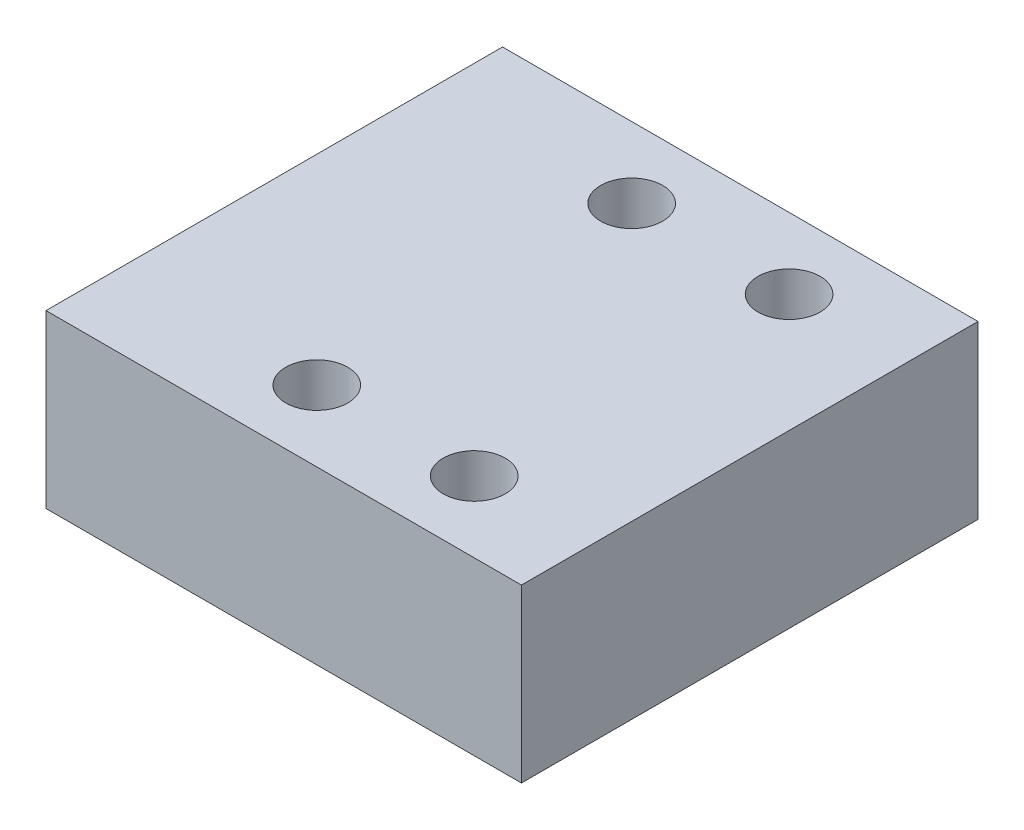
ISO-10303-21;
HEADER;
FILE_DESCRIPTION(('STEP AP214'),'2;1');
FILE_NAME('part.step','',(''),(''),'','','');
FILE_SCHEMA(('AUTOMOTIVE_DESIGN { 1 0 10303 214 1 1 1 1 }'));
ENDSEC;
DATA;
#1=APPLICATION_CONTEXT('core data for automotive mechanical design processes');
#2=APPLICATION_PROTOCOL_DEFINITION('international standard','automotive_design',2000,#1);
#3=PRODUCT_CONTEXT('',#1,'mechanical');
#4=PRODUCT('Part','Part','',(#3));
#5=PRODUCT_RELATED_PRODUCT_CATEGORY('part','',(#4));
#6=PRODUCT_DEFINITION_FORMATION('','',#4);
#7=PRODUCT_DEFINITION_CONTEXT('part definition',#1,'design');
#8=PRODUCT_DEFINITION('design','',#6,#7);
#9=PRODUCT_DEFINITION_SHAPE('','',#8);
#10=(LENGTH_UNIT() NAMED_UNIT(*) SI_UNIT(.MILLI.,.METRE.));
#11=(NAMED_UNIT(*) PLANE_ANGLE_UNIT() SI_UNIT($,.RADIAN.));
#12=(NAMED_UNIT(*) SI_UNIT($,.STERADIAN.) SOLID_ANGLE_UNIT());
#13=UNCERTAINTY_MEASURE_WITH_UNIT(LENGTH_MEASURE(1.E-05),#10,'distance_accuracy_value','');
#14=(GEOMETRIC_REPRESENTATION_CONTEXT(3) GLOBAL_UNCERTAINTY_ASSIGNED_CONTEXT((#13)) GLOBAL_UNIT_ASSIGNED_CONTEXT((#10,
#11,#12)) REPRESENTATION_CONTEXT('',''));
#15=CARTESIAN_POINT('',(0.,0.,0.));
#16=DIRECTION('',(0.,0.,1.));
#17=DIRECTION('',(1.,0.,0.));
#18=AXIS2_PLACEMENT_3D('',#15,#16,#17);
#19=CARTESIAN_POINT('',(0.,13.8303,0.));
#20=DIRECTION('',(0.,1.,0.));
#21=DIRECTION('',(0.,0.,1.));
#22=AXIS2_PLACEMENT_3D('',#19,#20,#21);
#23=PLANE('',#22);
#24=CARTESIAN_POINT('',(-0.482843347867575,13.8303,8.62574087965332));
#25=DIRECTION('',(0.,1.,0.));
#26=DIRECTION('',(0.,0.,-1.));
#27=AXIS2_PLACEMENT_3D('',#24,#25,#26);
#28=CIRCLE('',#27,2.5019);
#29=CARTESIAN_POINT('',(-0.482843347867575,13.8303,6.12384087965333));
#30=VERTEX_POINT('',#29);
#31=EDGE_CURVE('E121',#30,#30,#28,.T.);
#32=ORIENTED_EDGE('',*,*,#31,.F.);
#33=EDGE_LOOP('',(#32));
#34=FACE_BOUND('',#33,.T.);
#35=CARTESIAN_POINT('',(-0.482843347867582,13.8303,-16.7742591203467));
#36=DIRECTION('',(0.,1.,0.));
#37=DIRECTION('',(0.,0.,1.));
#38=AXIS2_PLACEMENT_3D('',#35,#36,#37);
#39=CIRCLE('',#38,2.5019);
#40=CARTESIAN_POINT('',(-0.482843347867582,13.8303,-19.2761591203467));
#41=VERTEX_POINT('',#40);
#42=EDGE_CURVE('E100',#41,#41,#39,.T.);
#43=ORIENTED_EDGE('',*,*,#42,.F.);
#44=EDGE_LOOP('',(#43));
#45=FACE_BOUND('',#44,.T.);
#46=DIRECTION('',(0.,0.,1.));
#47=VECTOR('',#46,1.);
#48=CARTESIAN_POINT('',(-29.3118433478676,13.8303,-22.4892591203467));
#49=LINE('',#48,#47);
#50=CARTESIAN_POINT('',(-29.3118433478676,13.8303,-22.4892591203467));
#51=VERTEX_POINT('',#50);
#52=CARTESIAN_POINT('',(-29.3118433478676,13.8303,14.3407408796533));
#53=VERTEX_POINT('',#52);
#54=EDGE_CURVE('E85',#51,#53,#49,.T.);
#55=ORIENTED_EDGE('',*,*,#54,.T.);
#56=DIRECTION('',(1.,0.,0.));
#57=VECTOR('',#56,1.);
#58=CARTESIAN_POINT('',(-29.3118433478676,13.8303,14.3407408796533));
#59=LINE('',#58,#57);
#60=CARTESIAN_POINT('',(9.04215665213242,13.8303,14.3407408796533));
#61=VERTEX_POINT('',#60);
#62=EDGE_CURVE('E80',#53,#61,#59,.T.);
#63=ORIENTED_EDGE('',*,*,#62,.T.);
#64=DIRECTION('',(0.,0.,-1.));
#65=VECTOR('',#64,1.);
#66=CARTESIAN_POINT('',(9.04215665213242,13.8303,-22.4892591203467));
#67=LINE('',#66,#65);
#68=CARTESIAN_POINT('',(9.04215665213242,13.8303,-22.4892591203467));
#69=VERTEX_POINT('',#68);
#70=EDGE_CURVE('E83',#61,#69,#67,.T.);
#71=ORIENTED_EDGE('',*,*,#70,.T.);
#72=DIRECTION('',(-1.,0.,0.));
#73=VECTOR('',#72,1.);
#74=CARTESIAN_POINT('',(-29.3118433478676,13.8303,-22.4892591203467));
#75=LINE('',#74,#73);
#76=EDGE_CURVE('E50',#69,#51,#75,.T.);
#77=ORIENTED_EDGE('',*,*,#76,.T.);
#78=EDGE_LOOP('',(#55,#63,#71,#77));
#79=FACE_BOUND('',#78,.T.);
#80=CARTESIAN_POINT('',(-13.1828433478676,13.8303,-16.7742591203467));
#81=DIRECTION('',(0.,1.,0.));
#82=DIRECTION('',(0.,0.,1.));
#83=AXIS2_PLACEMENT_3D('',#80,#81,#82);
#84=CIRCLE('',#83,2.5019);
#85=CARTESIAN_POINT('',(-13.1828433478676,13.8303,-19.2761591203467));
#86=VERTEX_POINT('',#85);
#87=EDGE_CURVE('E115',#86,#86,#84,.T.);
#88=ORIENTED_EDGE('',*,*,#87,.F.);
#89=EDGE_LOOP('',(#88));
#90=FACE_BOUND('',#89,.T.);
#91=CARTESIAN_POINT('',(-13.1828433478676,13.8303,8.62574087965332));
#92=DIRECTION('',(0.,1.,0.));
#93=DIRECTION('',(0.,0.,-1.));
#94=AXIS2_PLACEMENT_3D('',#91,#92,#93);
#95=CIRCLE('',#94,2.5019);
#96=CARTESIAN_POINT('',(-13.1828433478676,13.8303,6.12384087965332));
#97=VERTEX_POINT('',#96);
#98=EDGE_CURVE('E127',#97,#97,#95,.T.);
#99=ORIENTED_EDGE('',*,*,#98,.F.);
#100=EDGE_LOOP('',(#99));
#101=FACE_BOUND('',#100,.T.);
#102=ADVANCED_FACE('F33',(#34,#45,#79,#90,#101),#23,.T.);
#103=CARTESIAN_POINT('',(0.,0.,0.));
#104=DIRECTION('',(0.,1.,0.));
#105=DIRECTION('',(0.,0.,1.));
#106=AXIS2_PLACEMENT_3D('',#103,#104,#105);
#107=PLANE('',#106);
#108=CARTESIAN_POINT('',(-0.482843347867575,0.,8.62574087965332));
#109=DIRECTION('',(0.,1.,0.));
#110=DIRECTION('',(0.,0.,-1.));
#111=AXIS2_PLACEMENT_3D('',#108,#109,#110);
#112=CIRCLE('',#111,2.5019);
#113=CARTESIAN_POINT('',(-0.482843347867575,0.,6.12384087965333));
#114=VERTEX_POINT('',#113);
#115=EDGE_CURVE('E124',#114,#114,#112,.T.);
#116=ORIENTED_EDGE('',*,*,#115,.T.);
#117=EDGE_LOOP('',(#116));
#118=FACE_BOUND('',#117,.T.);
#119=CARTESIAN_POINT('',(-0.482843347867582,0.,-16.7742591203467));
#120=DIRECTION('',(0.,1.,0.));
#121=DIRECTION('',(0.,0.,1.));
#122=AXIS2_PLACEMENT_3D('',#119,#120,#121);
#123=CIRCLE('',#122,2.5019);
#124=CARTESIAN_POINT('',(-0.482843347867582,0.,-19.2761591203467));
#125=VERTEX_POINT('',#124);
#126=EDGE_CURVE('E112',#125,#125,#123,.T.);
#127=ORIENTED_EDGE('',*,*,#126,.T.);
#128=EDGE_LOOP('',(#127));
#129=FACE_BOUND('',#128,.T.);
#130=DIRECTION('',(0.,0.,1.));
#131=VECTOR('',#130,1.);
#132=CARTESIAN_POINT('',(-29.3118433478676,0.,-22.4892591203467));
#133=LINE('',#132,#131);
#134=CARTESIAN_POINT('',(-29.3118433478676,0.,-22.4892591203467));
#135=VERTEX_POINT('',#134);
#136=CARTESIAN_POINT('',(-29.3118433478676,0.,14.3407408796533));
#137=VERTEX_POINT('',#136);
#138=EDGE_CURVE('E97',#135,#137,#133,.T.);
#139=ORIENTED_EDGE('',*,*,#138,.F.);
#140=DIRECTION('',(-1.,0.,0.));
#141=VECTOR('',#140,1.);
#142=CARTESIAN_POINT('',(-29.3118433478676,0.,-22.4892591203467));
#143=LINE('',#142,#141);
#144=CARTESIAN_POINT('',(9.04215665213242,0.,-22.4892591203467));
#145=VERTEX_POINT('',#144);
#146=EDGE_CURVE('E73',#145,#135,#143,.T.);
#147=ORIENTED_EDGE('',*,*,#146,.F.);
#148=DIRECTION('',(0.,0.,-1.));
#149=VECTOR('',#148,1.);
#150=CARTESIAN_POINT('',(9.04215665213242,0.,-22.4892591203467));
#151=LINE('',#150,#149);
#152=CARTESIAN_POINT('',(9.04215665213242,0.,14.3407408796533));
#153=VERTEX_POINT('',#152);
#154=EDGE_CURVE('E67',#153,#145,#151,.T.);
#155=ORIENTED_EDGE('',*,*,#154,.F.);
#156=DIRECTION('',(1.,0.,0.));
#157=VECTOR('',#156,1.);
#158=CARTESIAN_POINT('',(-29.3118433478676,0.,14.3407408796533));
#159=LINE('',#158,#157);
#160=EDGE_CURVE('E89',#137,#153,#159,.T.);
#161=ORIENTED_EDGE('',*,*,#160,.F.);
#162=EDGE_LOOP('',(#139,#147,#155,#161));
#163=FACE_BOUND('',#162,.T.);
#164=CARTESIAN_POINT('',(-13.1828433478676,0.,-16.7742591203467));
#165=DIRECTION('',(0.,1.,0.));
#166=DIRECTION('',(0.,0.,1.));
#167=AXIS2_PLACEMENT_3D('',#164,#165,#166);
#168=CIRCLE('',#167,2.5019);
#169=CARTESIAN_POINT('',(-13.1828433478676,0.,-19.2761591203467));
#170=VERTEX_POINT('',#169);
#171=EDGE_CURVE('E118',#170,#170,#168,.T.);
#172=ORIENTED_EDGE('',*,*,#171,.T.);
#173=EDGE_LOOP('',(#172));
#174=FACE_BOUND('',#173,.T.);
#175=CARTESIAN_POINT('',(-13.1828433478676,0.,8.62574087965332));
#176=DIRECTION('',(0.,1.,0.));
#177=DIRECTION('',(0.,0.,-1.));
#178=AXIS2_PLACEMENT_3D('',#175,#176,#177);
#179=CIRCLE('',#178,2.5019);
#180=CARTESIAN_POINT('',(-13.1828433478676,0.,6.12384087965332));
#181=VERTEX_POINT('',#180);
#182=EDGE_CURVE('E130',#181,#181,#179,.T.);
#183=ORIENTED_EDGE('',*,*,#182,.T.);
#184=EDGE_LOOP('',(#183));
#185=FACE_BOUND('',#184,.T.);
#186=ADVANCED_FACE('F108',(#118,#129,#163,#174,#185),#107,.F.);
#187=CARTESIAN_POINT('',(-29.3118433478676,13.8303,-22.4892591203467));
#188=DIRECTION('',(1.,0.,0.));
#189=DIRECTION('',(0.,0.,-1.));
#190=AXIS2_PLACEMENT_3D('',#187,#188,#189);
#191=PLANE('',#190);
#192=ORIENTED_EDGE('',*,*,#138,.T.);
#193=DIRECTION('',(0.,-1.,0.));
#194=VECTOR('',#193,1.);
#195=CARTESIAN_POINT('',(-29.3118433478676,13.8303,14.3407408796533));
#196=LINE('',#195,#194);
#197=EDGE_CURVE('E11',#53,#137,#196,.T.);
#198=ORIENTED_EDGE('',*,*,#197,.F.);
#199=ORIENTED_EDGE('',*,*,#54,.F.);
#200=DIRECTION('',(0.,-1.,0.));
#201=VECTOR('',#200,1.);
#202=CARTESIAN_POINT('',(-29.3118433478676,13.8303,-22.4892591203467));
#203=LINE('',#202,#201);
#204=EDGE_CURVE('E93',#51,#135,#203,.T.);
#205=ORIENTED_EDGE('',*,*,#204,.T.);
#206=EDGE_LOOP('',(#192,#198,#199,#205));
#207=FACE_BOUND('',#206,.T.);
#208=ADVANCED_FACE('F35',(#207),#191,.F.);
#209=CARTESIAN_POINT('',(-29.3118433478676,13.8303,14.3407408796533));
#210=DIRECTION('',(0.,0.,-1.));
#211=DIRECTION('',(-1.,0.,0.));
#212=AXIS2_PLACEMENT_3D('',#209,#210,#211);
#213=PLANE('',#212);
#214=ORIENTED_EDGE('',*,*,#160,.T.);
#215=DIRECTION('',(0.,-1.,0.));
#216=VECTOR('',#215,1.);
#217=CARTESIAN_POINT('',(9.04215665213242,13.8303,14.3407408796533));
#218=LINE('',#217,#216);
#219=EDGE_CURVE('E42',#61,#153,#218,.T.);
#220=ORIENTED_EDGE('',*,*,#219,.F.);
#221=ORIENTED_EDGE('',*,*,#62,.F.);
#222=ORIENTED_EDGE('',*,*,#197,.T.);
#223=EDGE_LOOP('',(#214,#220,#221,#222));
#224=FACE_BOUND('',#223,.T.);
#225=ADVANCED_FACE('F88',(#224),#213,.F.);
#226=CARTESIAN_POINT('',(9.04215665213242,13.8303,-22.4892591203467));
#227=DIRECTION('',(-1.,0.,0.));
#228=DIRECTION('',(0.,0.,1.));
#229=AXIS2_PLACEMENT_3D('',#226,#227,#228);
#230=PLANE('',#229);
#231=ORIENTED_EDGE('',*,*,#154,.T.);
#232=DIRECTION('',(0.,-1.,0.));
#233=VECTOR('',#232,1.);
#234=CARTESIAN_POINT('',(9.04215665213242,13.8303,-22.4892591203467));
#235=LINE('',#234,#233);
#236=EDGE_CURVE('E90',#69,#145,#235,.T.);
#237=ORIENTED_EDGE('',*,*,#236,.F.);
#238=ORIENTED_EDGE('',*,*,#70,.F.);
#239=ORIENTED_EDGE('',*,*,#219,.T.);
#240=EDGE_LOOP('',(#231,#237,#238,#239));
#241=FACE_BOUND('',#240,.T.);
#242=ADVANCED_FACE('F91',(#241),#230,.F.);
#243=CARTESIAN_POINT('',(-29.3118433478676,13.8303,-22.4892591203467));
#244=DIRECTION('',(0.,0.,1.));
#245=DIRECTION('',(1.,0.,0.));
#246=AXIS2_PLACEMENT_3D('',#243,#244,#245);
#247=PLANE('',#246);
#248=ORIENTED_EDGE('',*,*,#146,.T.);
#249=ORIENTED_EDGE('',*,*,#204,.F.);
#250=ORIENTED_EDGE('',*,*,#76,.F.);
#251=ORIENTED_EDGE('',*,*,#236,.T.);
#252=EDGE_LOOP('',(#248,#249,#250,#251));
#253=FACE_BOUND('',#252,.T.);
#254=ADVANCED_FACE('F105',(#253),#247,.F.);
#255=CARTESIAN_POINT('',(-0.482843347867582,13.8303,-16.7742591203467));
#256=DIRECTION('',(0.,-1.,0.));
#257=DIRECTION('',(0.,0.,-1.));
#258=AXIS2_PLACEMENT_3D('',#255,#256,#257);
#259=CYLINDRICAL_SURFACE('',#258,2.5019);
#260=CARTESIAN_POINT('',(-0.482843347867582,13.8303,-19.2761591203467));
#261=CARTESIAN_POINT('',(-0.482843347867582,13.686234375,-19.2761591203467));
#262=CARTESIAN_POINT('',(-0.482843347867582,13.54216875,-19.2761591203467));
#263=CARTESIAN_POINT('',(-0.482843347867582,13.2540375,-19.2761591203467));
#264=CARTESIAN_POINT('',(-0.482843347867582,13.109971875,-19.2761591203467));
#265=CARTESIAN_POINT('',(-0.482843347867582,12.821840625,-19.2761591203467));
#266=CARTESIAN_POINT('',(-0.482843347867582,12.677775,-19.2761591203467));
#267=CARTESIAN_POINT('',(-0.482843347867582,12.38964375,-19.2761591203467));
#268=CARTESIAN_POINT('',(-0.482843347867582,12.245578125,-19.2761591203467));
#269=CARTESIAN_POINT('',(-0.482843347867582,11.957446875,-19.2761591203467));
#270=CARTESIAN_POINT('',(-0.482843347867582,11.81338125,-19.2761591203467));
#271=CARTESIAN_POINT('',(-0.482843347867582,11.52525,-19.2761591203467));
#272=CARTESIAN_POINT('',(-0.482843347867582,11.381184375,-19.2761591203467));
#273=CARTESIAN_POINT('',(-0.482843347867582,11.093053125,-19.2761591203467));
#274=CARTESIAN_POINT('',(-0.482843347867582,10.9489875,-19.2761591203467));
#275=CARTESIAN_POINT('',(-0.482843347867582,10.66085625,-19.2761591203467));
#276=CARTESIAN_POINT('',(-0.482843347867582,10.516790625,-19.2761591203467));
#277=CARTESIAN_POINT('',(-0.482843347867582,10.228659375,-19.2761591203467));
#278=CARTESIAN_POINT('',(-0.482843347867582,10.08459375,-19.2761591203467));
#279=CARTESIAN_POINT('',(-0.482843347867582,9.7964625,-19.2761591203467));
#280=CARTESIAN_POINT('',(-0.482843347867582,9.652396875,-19.2761591203467));
#281=CARTESIAN_POINT('',(-0.482843347867582,9.364265625,-19.2761591203467));
#282=CARTESIAN_POINT('',(-0.482843347867582,9.2202,-19.2761591203467));
#283=CARTESIAN_POINT('',(-0.482843347867582,8.93206875,-19.2761591203467));
#284=CARTESIAN_POINT('',(-0.482843347867582,8.788003125,-19.2761591203467));
#285=CARTESIAN_POINT('',(-0.482843347867582,8.499871875,-19.2761591203467));
#286=CARTESIAN_POINT('',(-0.482843347867582,8.35580625,-19.2761591203467));
#287=CARTESIAN_POINT('',(-0.482843347867582,8.067675,-19.2761591203467));
#288=CARTESIAN_POINT('',(-0.482843347867582,7.923609375,-19.2761591203467));
#289=CARTESIAN_POINT('',(-0.482843347867582,7.635478125,-19.2761591203467));
#290=CARTESIAN_POINT('',(-0.482843347867582,7.4914125,-19.2761591203467));
#291=CARTESIAN_POINT('',(-0.482843347867582,7.20328125,-19.2761591203467));
#292=CARTESIAN_POINT('',(-0.482843347867582,7.059215625,-19.2761591203467));
#293=CARTESIAN_POINT('',(-0.482843347867582,6.771084375,-19.2761591203467));
#294=CARTESIAN_POINT('',(-0.482843347867582,6.62701875,-19.2761591203467));
#295=CARTESIAN_POINT('',(-0.482843347867582,6.3388875,-19.2761591203467));
#296=CARTESIAN_POINT('',(-0.482843347867582,6.194821875,-19.2761591203467));
#297=CARTESIAN_POINT('',(-0.482843347867582,5.906690625,-19.2761591203467));
#298=CARTESIAN_POINT('',(-0.482843347867582,5.762625,-19.2761591203467));
#299=CARTESIAN_POINT('',(-0.482843347867582,5.47449375,-19.2761591203467));
#300=CARTESIAN_POINT('',(-0.482843347867582,5.330428125,-19.2761591203467));
#301=CARTESIAN_POINT('',(-0.482843347867582,5.042296875,-19.2761591203467));
#302=CARTESIAN_POINT('',(-0.482843347867582,4.89823125,-19.2761591203467));
#303=CARTESIAN_POINT('',(-0.482843347867582,4.6101,-19.2761591203467));
#304=CARTESIAN_POINT('',(-0.482843347867582,4.466034375,-19.2761591203467));
#305=CARTESIAN_POINT('',(-0.482843347867582,4.177903125,-19.2761591203467));
#306=CARTESIAN_POINT('',(-0.482843347867582,4.0338375,-19.2761591203467));
#307=CARTESIAN_POINT('',(-0.482843347867582,3.74570625,-19.2761591203467));
#308=CARTESIAN_POINT('',(-0.482843347867582,3.601640625,-19.2761591203467));
#309=CARTESIAN_POINT('',(-0.482843347867582,3.313509375,-19.2761591203467));
#310=CARTESIAN_POINT('',(-0.482843347867582,3.16944375,-19.2761591203467));
#311=CARTESIAN_POINT('',(-0.482843347867582,2.8813125,-19.2761591203467));
#312=CARTESIAN_POINT('',(-0.482843347867582,2.737246875,-19.2761591203467));
#313=CARTESIAN_POINT('',(-0.482843347867582,2.449115625,-19.2761591203467));
#314=CARTESIAN_POINT('',(-0.482843347867582,2.30505,-19.2761591203467));
#315=CARTESIAN_POINT('',(-0.482843347867582,2.01691875,-19.2761591203467));
#316=CARTESIAN_POINT('',(-0.482843347867582,1.872853125,-19.2761591203467));
#317=CARTESIAN_POINT('',(-0.482843347867582,1.584721875,-19.2761591203467));
#318=CARTESIAN_POINT('',(-0.482843347867582,1.44065625,-19.2761591203467));
#319=CARTESIAN_POINT('',(-0.482843347867582,1.152525,-19.2761591203467));
#320=CARTESIAN_POINT('',(-0.482843347867582,1.008459375,-19.2761591203467));
#321=CARTESIAN_POINT('',(-0.482843347867582,0.720328125,-19.2761591203467));
#322=CARTESIAN_POINT('',(-0.482843347867582,0.5762625,-19.2761591203467));
#323=CARTESIAN_POINT('',(-0.482843347867582,0.28813125,-19.2761591203467));
#324=CARTESIAN_POINT('',(-0.482843347867582,0.144065625,-19.2761591203467));
#325=CARTESIAN_POINT('',(-0.482843347867582,0.,-19.2761591203467));
#326=B_SPLINE_CURVE_WITH_KNOTS('',3,(#260,#261,#262,#263,#264,#265,#266,#267,#268,#269,#270,
#271,#272,#273,#274,#275,#276,#277,#278,#279,#280,#281,#282,#283,#284,#285,#286,#287,#288,#289,
#290,#291,#292,#293,#294,#295,#296,#297,#298,#299,#300,#301,#302,#303,#304,#305,#306,#307,#308,
#309,#310,#311,#312,#313,#314,#315,#316,#317,#318,#319,#320,#321,#322,#323,#324,#325),
.UNSPECIFIED.,.F.,.F.,(4,2,2,2,2,2,2,2,2,2,2,2,2,2,2,2,2,2,2,2,2,2,2,2,2,2,2,2,2,2,2,2,4),(0.,
0.432196875000001,0.864393750000001,1.296590625,1.7287875,2.160984375,2.59318125,3.025378125,
3.457575,3.889771875,4.32196875,4.754165625,5.1863625,5.618559375,6.05075625,6.482953125,
6.91515,7.347346875,7.77954375,8.211740625,8.6439375,9.076134375,9.50833125,9.940528125,
10.372725,10.804921875,11.23711875,11.669315625,12.1015125,12.533709375,12.96590625,
13.398103125,13.8303),.UNSPECIFIED.);
#327=EDGE_CURVE('BSEAM150',#41,#125,#326,.T.);
#328=ORIENTED_EDGE('',*,*,#42,.T.);
#329=ORIENTED_EDGE('',*,*,#126,.F.);
#330=ORIENTED_EDGE('',*,*,#327,.T.);
#331=ORIENTED_EDGE('',*,*,#327,.F.);
#332=EDGE_LOOP('',(#328,#330,#329,#331));
#333=FACE_BOUND('',#332,.T.);
#334=ADVANCED_FACE('F150',(#333),#259,.F.);
#335=CARTESIAN_POINT('',(-13.1828433478676,13.8303,-16.7742591203467));
#336=DIRECTION('',(0.,-1.,0.));
#337=DIRECTION('',(0.,0.,-1.));
#338=AXIS2_PLACEMENT_3D('',#335,#336,#337);
#339=CYLINDRICAL_SURFACE('',#338,2.5019);
#340=CARTESIAN_POINT('',(-13.1828433478676,13.8303,-19.2761591203467));
#341=CARTESIAN_POINT('',(-13.1828433478676,13.686234375,-19.2761591203467));
#342=CARTESIAN_POINT('',(-13.1828433478676,13.54216875,-19.2761591203467));
#343=CARTESIAN_POINT('',(-13.1828433478676,13.2540375,-19.2761591203467));
#344=CARTESIAN_POINT('',(-13.1828433478676,13.109971875,-19.2761591203467));
#345=CARTESIAN_POINT('',(-13.1828433478676,12.821840625,-19.2761591203467));
#346=CARTESIAN_POINT('',(-13.1828433478676,12.677775,-19.2761591203467));
#347=CARTESIAN_POINT('',(-13.1828433478676,12.38964375,-19.2761591203467));
#348=CARTESIAN_POINT('',(-13.1828433478676,12.245578125,-19.2761591203467));
#349=CARTESIAN_POINT('',(-13.1828433478676,11.957446875,-19.2761591203467));
#350=CARTESIAN_POINT('',(-13.1828433478676,11.81338125,-19.2761591203467));
#351=CARTESIAN_POINT('',(-13.1828433478676,11.52525,-19.2761591203467));
#352=CARTESIAN_POINT('',(-13.1828433478676,11.381184375,-19.2761591203467));
#353=CARTESIAN_POINT('',(-13.1828433478676,11.093053125,-19.2761591203467));
#354=CARTESIAN_POINT('',(-13.1828433478676,10.9489875,-19.2761591203467));
#355=CARTESIAN_POINT('',(-13.1828433478676,10.66085625,-19.2761591203467));
#356=CARTESIAN_POINT('',(-13.1828433478676,10.516790625,-19.2761591203467));
#357=CARTESIAN_POINT('',(-13.1828433478676,10.228659375,-19.2761591203467));
#358=CARTESIAN_POINT('',(-13.1828433478676,10.08459375,-19.2761591203467));
#359=CARTESIAN_POINT('',(-13.1828433478676,9.7964625,-19.2761591203467));
#360=CARTESIAN_POINT('',(-13.1828433478676,9.652396875,-19.2761591203467));
#361=CARTESIAN_POINT('',(-13.1828433478676,9.364265625,-19.2761591203467));
#362=CARTESIAN_POINT('',(-13.1828433478676,9.2202,-19.2761591203467));
#363=CARTESIAN_POINT('',(-13.1828433478676,8.93206875,-19.2761591203467));
#364=CARTESIAN_POINT('',(-13.1828433478676,8.788003125,-19.2761591203467));
#365=CARTESIAN_POINT('',(-13.1828433478676,8.499871875,-19.2761591203467));
#366=CARTESIAN_POINT('',(-13.1828433478676,8.35580625,-19.2761591203467));
#367=CARTESIAN_POINT('',(-13.1828433478676,8.067675,-19.2761591203467));
#368=CARTESIAN_POINT('',(-13.1828433478676,7.923609375,-19.2761591203467));
#369=CARTESIAN_POINT('',(-13.1828433478676,7.635478125,-19.2761591203467));
#370=CARTESIAN_POINT('',(-13.1828433478676,7.4914125,-19.2761591203467));
#371=CARTESIAN_POINT('',(-13.1828433478676,7.20328125,-19.2761591203467));
#372=CARTESIAN_POINT('',(-13.1828433478676,7.059215625,-19.2761591203467));
#373=CARTESIAN_POINT('',(-13.1828433478676,6.771084375,-19.2761591203467));
#374=CARTESIAN_POINT('',(-13.1828433478676,6.62701875,-19.2761591203467));
#375=CARTESIAN_POINT('',(-13.1828433478676,6.3388875,-19.2761591203467));
#376=CARTESIAN_POINT('',(-13.1828433478676,6.194821875,-19.2761591203467));
#377=CARTESIAN_POINT('',(-13.1828433478676,5.906690625,-19.2761591203467));
#378=CARTESIAN_POINT('',(-13.1828433478676,5.762625,-19.2761591203467));
#379=CARTESIAN_POINT('',(-13.1828433478676,5.47449375,-19.2761591203467));
#380=CARTESIAN_POINT('',(-13.1828433478676,5.330428125,-19.2761591203467));
#381=CARTESIAN_POINT('',(-13.1828433478676,5.042296875,-19.2761591203467));
#382=CARTESIAN_POINT('',(-13.1828433478676,4.89823125,-19.2761591203467));
#383=CARTESIAN_POINT('',(-13.1828433478676,4.6101,-19.2761591203467));
#384=CARTESIAN_POINT('',(-13.1828433478676,4.466034375,-19.2761591203467));
#385=CARTESIAN_POINT('',(-13.1828433478676,4.177903125,-19.2761591203467));
#386=CARTESIAN_POINT('',(-13.1828433478676,4.0338375,-19.2761591203467));
#387=CARTESIAN_POINT('',(-13.1828433478676,3.74570625,-19.2761591203467));
#388=CARTESIAN_POINT('',(-13.1828433478676,3.601640625,-19.2761591203467));
#389=CARTESIAN_POINT('',(-13.1828433478676,3.313509375,-19.2761591203467));
#390=CARTESIAN_POINT('',(-13.1828433478676,3.16944375,-19.2761591203467));
#391=CARTESIAN_POINT('',(-13.1828433478676,2.8813125,-19.2761591203467));
#392=CARTESIAN_POINT('',(-13.1828433478676,2.737246875,-19.2761591203467));
#393=CARTESIAN_POINT('',(-13.1828433478676,2.449115625,-19.2761591203467));
#394=CARTESIAN_POINT('',(-13.1828433478676,2.30505,-19.2761591203467));
#395=CARTESIAN_POINT('',(-13.1828433478676,2.01691875,-19.2761591203467));
#396=CARTESIAN_POINT('',(-13.1828433478676,1.872853125,-19.2761591203467));
#397=CARTESIAN_POINT('',(-13.1828433478676,1.584721875,-19.2761591203467));
#398=CARTESIAN_POINT('',(-13.1828433478676,1.44065625,-19.2761591203467));
#399=CARTESIAN_POINT('',(-13.1828433478676,1.152525,-19.2761591203467));
#400=CARTESIAN_POINT('',(-13.1828433478676,1.008459375,-19.2761591203467));
#401=CARTESIAN_POINT('',(-13.1828433478676,0.720328125,-19.2761591203467));
#402=CARTESIAN_POINT('',(-13.1828433478676,0.5762625,-19.2761591203467));
#403=CARTESIAN_POINT('',(-13.1828433478676,0.28813125,-19.2761591203467));
#404=CARTESIAN_POINT('',(-13.1828433478676,0.144065625,-19.2761591203467));
#405=CARTESIAN_POINT('',(-13.1828433478676,0.,-19.2761591203467));
#406=B_SPLINE_CURVE_WITH_KNOTS('',3,(#340,#341,#342,#343,#344,#345,#346,#347,#348,#349,#350,
#351,#352,#353,#354,#355,#356,#357,#358,#359,#360,#361,#362,#363,#364,#365,#366,#367,#368,#369,
#370,#371,#372,#373,#374,#375,#376,#377,#378,#379,#380,#381,#382,#383,#384,#385,#386,#387,#388,
#389,#390,#391,#392,#393,#394,#395,#396,#397,#398,#399,#400,#401,#402,#403,#404,#405),
.UNSPECIFIED.,.F.,.F.,(4,2,2,2,2,2,2,2,2,2,2,2,2,2,2,2,2,2,2,2,2,2,2,2,2,2,2,2,2,2,2,2,4),(0.,
0.432196875000001,0.864393750000001,1.296590625,1.7287875,2.160984375,2.59318125,3.025378125,
3.457575,3.889771875,4.32196875,4.754165625,5.1863625,5.618559375,6.05075625,6.482953125,
6.91515,7.347346875,7.77954375,8.211740625,8.6439375,9.076134375,9.50833125,9.940528125,
10.372725,10.804921875,11.23711875,11.669315625,12.1015125,12.533709375,12.96590625,
13.398103125,13.8303),.UNSPECIFIED.);
#407=EDGE_CURVE('BSEAM196',#86,#170,#406,.T.);
#408=ORIENTED_EDGE('',*,*,#87,.T.);
#409=ORIENTED_EDGE('',*,*,#171,.F.);
#410=ORIENTED_EDGE('',*,*,#407,.T.);
#411=ORIENTED_EDGE('',*,*,#407,.F.);
#412=EDGE_LOOP('',(#408,#410,#409,#411));
#413=FACE_BOUND('',#412,.T.);
#414=ADVANCED_FACE('F196',(#413),#339,.F.);
#415=CARTESIAN_POINT('',(-0.482843347867575,13.8303,8.62574087965332));
#416=DIRECTION('',(0.,-1.,0.));
#417=DIRECTION('',(0.,0.,-1.));
#418=AXIS2_PLACEMENT_3D('',#415,#416,#417);
#419=CYLINDRICAL_SURFACE('',#418,2.5019);
#420=CARTESIAN_POINT('',(-0.482843347867575,13.8303,6.12384087965333));
#421=CARTESIAN_POINT('',(-0.482843347867575,13.686234375,6.12384087965333));
#422=CARTESIAN_POINT('',(-0.482843347867575,13.54216875,6.12384087965333));
#423=CARTESIAN_POINT('',(-0.482843347867575,13.2540375,6.12384087965333));
#424=CARTESIAN_POINT('',(-0.482843347867575,13.109971875,6.12384087965333));
#425=CARTESIAN_POINT('',(-0.482843347867575,12.821840625,6.12384087965333));
#426=CARTESIAN_POINT('',(-0.482843347867575,12.677775,6.12384087965333));
#427=CARTESIAN_POINT('',(-0.482843347867575,12.38964375,6.12384087965333));
#428=CARTESIAN_POINT('',(-0.482843347867575,12.245578125,6.12384087965333));
#429=CARTESIAN_POINT('',(-0.482843347867575,11.957446875,6.12384087965333));
#430=CARTESIAN_POINT('',(-0.482843347867575,11.81338125,6.12384087965333));
#431=CARTESIAN_POINT('',(-0.482843347867575,11.52525,6.12384087965333));
#432=CARTESIAN_POINT('',(-0.482843347867575,11.381184375,6.12384087965333));
#433=CARTESIAN_POINT('',(-0.482843347867575,11.093053125,6.12384087965333));
#434=CARTESIAN_POINT('',(-0.482843347867575,10.9489875,6.12384087965333));
#435=CARTESIAN_POINT('',(-0.482843347867575,10.66085625,6.12384087965333));
#436=CARTESIAN_POINT('',(-0.482843347867575,10.516790625,6.12384087965333));
#437=CARTESIAN_POINT('',(-0.482843347867575,10.228659375,6.12384087965333));
#438=CARTESIAN_POINT('',(-0.482843347867575,10.08459375,6.12384087965333));
#439=CARTESIAN_POINT('',(-0.482843347867575,9.7964625,6.12384087965333));
#440=CARTESIAN_POINT('',(-0.482843347867575,9.652396875,6.12384087965333));
#441=CARTESIAN_POINT('',(-0.482843347867575,9.364265625,6.12384087965333));
#442=CARTESIAN_POINT('',(-0.482843347867575,9.2202,6.12384087965333));
#443=CARTESIAN_POINT('',(-0.482843347867575,8.93206875,6.12384087965333));
#444=CARTESIAN_POINT('',(-0.482843347867575,8.788003125,6.12384087965333));
#445=CARTESIAN_POINT('',(-0.482843347867575,8.499871875,6.12384087965333));
#446=CARTESIAN_POINT('',(-0.482843347867575,8.35580625,6.12384087965333));
#447=CARTESIAN_POINT('',(-0.482843347867575,8.067675,6.12384087965333));
#448=CARTESIAN_POINT('',(-0.482843347867575,7.923609375,6.12384087965333));
#449=CARTESIAN_POINT('',(-0.482843347867575,7.635478125,6.12384087965333));
#450=CARTESIAN_POINT('',(-0.482843347867575,7.4914125,6.12384087965333));
#451=CARTESIAN_POINT('',(-0.482843347867575,7.20328125,6.12384087965333));
#452=CARTESIAN_POINT('',(-0.482843347867575,7.059215625,6.12384087965333));
#453=CARTESIAN_POINT('',(-0.482843347867575,6.771084375,6.12384087965333));
#454=CARTESIAN_POINT('',(-0.482843347867575,6.62701875,6.12384087965333));
#455=CARTESIAN_POINT('',(-0.482843347867575,6.3388875,6.12384087965333));
#456=CARTESIAN_POINT('',(-0.482843347867575,6.194821875,6.12384087965333));
#457=CARTESIAN_POINT('',(-0.482843347867575,5.906690625,6.12384087965333));
#458=CARTESIAN_POINT('',(-0.482843347867575,5.762625,6.12384087965333));
#459=CARTESIAN_POINT('',(-0.482843347867575,5.47449375,6.12384087965333));
#460=CARTESIAN_POINT('',(-0.482843347867575,5.330428125,6.12384087965333));
#461=CARTESIAN_POINT('',(-0.482843347867575,5.042296875,6.12384087965333));
#462=CARTESIAN_POINT('',(-0.482843347867575,4.89823125,6.12384087965333));
#463=CARTESIAN_POINT('',(-0.482843347867575,4.6101,6.12384087965333));
#464=CARTESIAN_POINT('',(-0.482843347867575,4.466034375,6.12384087965333));
#465=CARTESIAN_POINT('',(-0.482843347867575,4.177903125,6.12384087965333));
#466=CARTESIAN_POINT('',(-0.482843347867575,4.0338375,6.12384087965333));
#467=CARTESIAN_POINT('',(-0.482843347867575,3.74570625,6.12384087965333));
#468=CARTESIAN_POINT('',(-0.482843347867575,3.601640625,6.12384087965333));
#469=CARTESIAN_POINT('',(-0.482843347867575,3.313509375,6.12384087965333));
#470=CARTESIAN_POINT('',(-0.482843347867575,3.16944375,6.12384087965333));
#471=CARTESIAN_POINT('',(-0.482843347867575,2.8813125,6.12384087965333));
#472=CARTESIAN_POINT('',(-0.482843347867575,2.737246875,6.12384087965333));
#473=CARTESIAN_POINT('',(-0.482843347867575,2.449115625,6.12384087965333));
#474=CARTESIAN_POINT('',(-0.482843347867575,2.30505,6.12384087965333));
#475=CARTESIAN_POINT('',(-0.482843347867575,2.01691875,6.12384087965333));
#476=CARTESIAN_POINT('',(-0.482843347867575,1.872853125,6.12384087965333));
#477=CARTESIAN_POINT('',(-0.482843347867575,1.584721875,6.12384087965333));
#478=CARTESIAN_POINT('',(-0.482843347867575,1.44065625,6.12384087965333));
#479=CARTESIAN_POINT('',(-0.482843347867575,1.152525,6.12384087965333));
#480=CARTESIAN_POINT('',(-0.482843347867575,1.008459375,6.12384087965333));
#481=CARTESIAN_POINT('',(-0.482843347867575,0.720328125,6.12384087965333));
#482=CARTESIAN_POINT('',(-0.482843347867575,0.5762625,6.12384087965333));
#483=CARTESIAN_POINT('',(-0.482843347867575,0.28813125,6.12384087965333));
#484=CARTESIAN_POINT('',(-0.482843347867575,0.144065625,6.12384087965333));
#485=CARTESIAN_POINT('',(-0.482843347867575,0.,6.12384087965333));
#486=B_SPLINE_CURVE_WITH_KNOTS('',3,(#420,#421,#422,#423,#424,#425,#426,#427,#428,#429,#430,
#431,#432,#433,#434,#435,#436,#437,#438,#439,#440,#441,#442,#443,#444,#445,#446,#447,#448,#449,
#450,#451,#452,#453,#454,#455,#456,#457,#458,#459,#460,#461,#462,#463,#464,#465,#466,#467,#468,
#469,#470,#471,#472,#473,#474,#475,#476,#477,#478,#479,#480,#481,#482,#483,#484,#485),
.UNSPECIFIED.,.F.,.F.,(4,2,2,2,2,2,2,2,2,2,2,2,2,2,2,2,2,2,2,2,2,2,2,2,2,2,2,2,2,2,2,2,4),(0.,
0.432196875000001,0.864393750000001,1.296590625,1.7287875,2.160984375,2.59318125,3.025378125,
3.457575,3.889771875,4.32196875,4.754165625,5.1863625,5.618559375,6.05075625,6.482953125,
6.91515,7.347346875,7.77954375,8.211740625,8.6439375,9.076134375,9.50833125,9.940528125,
10.372725,10.804921875,11.23711875,11.669315625,12.1015125,12.533709375,12.96590625,
13.398103125,13.8303),.UNSPECIFIED.);
#487=EDGE_CURVE('BSEAM204',#30,#114,#486,.T.);
#488=ORIENTED_EDGE('',*,*,#31,.T.);
#489=ORIENTED_EDGE('',*,*,#115,.F.);
#490=ORIENTED_EDGE('',*,*,#487,.T.);
#491=ORIENTED_EDGE('',*,*,#487,.F.);
#492=EDGE_LOOP('',(#488,#490,#489,#491));
#493=FACE_BOUND('',#492,.T.);
#494=ADVANCED_FACE('F204',(#493),#419,.F.);
#495=CARTESIAN_POINT('',(-13.1828433478676,13.8303,8.62574087965332));
#496=DIRECTION('',(0.,-1.,0.));
#497=DIRECTION('',(0.,0.,-1.));
#498=AXIS2_PLACEMENT_3D('',#495,#496,#497);
#499=CYLINDRICAL_SURFACE('',#498,2.5019);
#500=CARTESIAN_POINT('',(-13.1828433478676,13.8303,6.12384087965332));
#501=CARTESIAN_POINT('',(-13.1828433478676,13.686234375,6.12384087965332));
#502=CARTESIAN_POINT('',(-13.1828433478676,13.54216875,6.12384087965332));
#503=CARTESIAN_POINT('',(-13.1828433478676,13.2540375,6.12384087965332));
#504=CARTESIAN_POINT('',(-13.1828433478676,13.109971875,6.12384087965332));
#505=CARTESIAN_POINT('',(-13.1828433478676,12.821840625,6.12384087965332));
#506=CARTESIAN_POINT('',(-13.1828433478676,12.677775,6.12384087965332));
#507=CARTESIAN_POINT('',(-13.1828433478676,12.38964375,6.12384087965332));
#508=CARTESIAN_POINT('',(-13.1828433478676,12.245578125,6.12384087965332));
#509=CARTESIAN_POINT('',(-13.1828433478676,11.957446875,6.12384087965332));
#510=CARTESIAN_POINT('',(-13.1828433478676,11.81338125,6.12384087965332));
#511=CARTESIAN_POINT('',(-13.1828433478676,11.52525,6.12384087965332));
#512=CARTESIAN_POINT('',(-13.1828433478676,11.381184375,6.12384087965332));
#513=CARTESIAN_POINT('',(-13.1828433478676,11.093053125,6.12384087965332));
#514=CARTESIAN_POINT('',(-13.1828433478676,10.9489875,6.12384087965332));
#515=CARTESIAN_POINT('',(-13.1828433478676,10.66085625,6.12384087965332));
#516=CARTESIAN_POINT('',(-13.1828433478676,10.516790625,6.12384087965332));
#517=CARTESIAN_POINT('',(-13.1828433478676,10.228659375,6.12384087965332));
#518=CARTESIAN_POINT('',(-13.1828433478676,10.08459375,6.12384087965332));
#519=CARTESIAN_POINT('',(-13.1828433478676,9.7964625,6.12384087965332));
#520=CARTESIAN_POINT('',(-13.1828433478676,9.652396875,6.12384087965332));
#521=CARTESIAN_POINT('',(-13.1828433478676,9.364265625,6.12384087965332));
#522=CARTESIAN_POINT('',(-13.1828433478676,9.2202,6.12384087965332));
#523=CARTESIAN_POINT('',(-13.1828433478676,8.93206875,6.12384087965332));
#524=CARTESIAN_POINT('',(-13.1828433478676,8.788003125,6.12384087965332));
#525=CARTESIAN_POINT('',(-13.1828433478676,8.499871875,6.12384087965332));
#526=CARTESIAN_POINT('',(-13.1828433478676,8.35580625,6.12384087965332));
#527=CARTESIAN_POINT('',(-13.1828433478676,8.067675,6.12384087965332));
#528=CARTESIAN_POINT('',(-13.1828433478676,7.923609375,6.12384087965332));
#529=CARTESIAN_POINT('',(-13.1828433478676,7.635478125,6.12384087965332));
#530=CARTESIAN_POINT('',(-13.1828433478676,7.4914125,6.12384087965332));
#531=CARTESIAN_POINT('',(-13.1828433478676,7.20328125,6.12384087965332));
#532=CARTESIAN_POINT('',(-13.1828433478676,7.059215625,6.12384087965332));
#533=CARTESIAN_POINT('',(-13.1828433478676,6.771084375,6.12384087965332));
#534=CARTESIAN_POINT('',(-13.1828433478676,6.62701875,6.12384087965332));
#535=CARTESIAN_POINT('',(-13.1828433478676,6.3388875,6.12384087965332));
#536=CARTESIAN_POINT('',(-13.1828433478676,6.194821875,6.12384087965332));
#537=CARTESIAN_POINT('',(-13.1828433478676,5.906690625,6.12384087965332));
#538=CARTESIAN_POINT('',(-13.1828433478676,5.762625,6.12384087965332));
#539=CARTESIAN_POINT('',(-13.1828433478676,5.47449375,6.12384087965332));
#540=CARTESIAN_POINT('',(-13.1828433478676,5.330428125,6.12384087965332));
#541=CARTESIAN_POINT('',(-13.1828433478676,5.042296875,6.12384087965332));
#542=CARTESIAN_POINT('',(-13.1828433478676,4.89823125,6.12384087965332));
#543=CARTESIAN_POINT('',(-13.1828433478676,4.6101,6.12384087965332));
#544=CARTESIAN_POINT('',(-13.1828433478676,4.466034375,6.12384087965332));
#545=CARTESIAN_POINT('',(-13.1828433478676,4.177903125,6.12384087965332));
#546=CARTESIAN_POINT('',(-13.1828433478676,4.0338375,6.12384087965332));
#547=CARTESIAN_POINT('',(-13.1828433478676,3.74570625,6.12384087965332));
#548=CARTESIAN_POINT('',(-13.1828433478676,3.601640625,6.12384087965332));
#549=CARTESIAN_POINT('',(-13.1828433478676,3.313509375,6.12384087965332));
#550=CARTESIAN_POINT('',(-13.1828433478676,3.16944375,6.12384087965332));
#551=CARTESIAN_POINT('',(-13.1828433478676,2.8813125,6.12384087965332));
#552=CARTESIAN_POINT('',(-13.1828433478676,2.737246875,6.12384087965332));
#553=CARTESIAN_POINT('',(-13.1828433478676,2.449115625,6.12384087965332));
#554=CARTESIAN_POINT('',(-13.1828433478676,2.30505,6.12384087965332));
#555=CARTESIAN_POINT('',(-13.1828433478676,2.01691875,6.12384087965332));
#556=CARTESIAN_POINT('',(-13.1828433478676,1.872853125,6.12384087965332));
#557=CARTESIAN_POINT('',(-13.1828433478676,1.584721875,6.12384087965332));
#558=CARTESIAN_POINT('',(-13.1828433478676,1.44065625,6.12384087965332));
#559=CARTESIAN_POINT('',(-13.1828433478676,1.152525,6.12384087965332));
#560=CARTESIAN_POINT('',(-13.1828433478676,1.008459375,6.12384087965332));
#561=CARTESIAN_POINT('',(-13.1828433478676,0.720328125,6.12384087965332));
#562=CARTESIAN_POINT('',(-13.1828433478676,0.5762625,6.12384087965332));
#563=CARTESIAN_POINT('',(-13.1828433478676,0.28813125,6.12384087965332));
#564=CARTESIAN_POINT('',(-13.1828433478676,0.144065625,6.12384087965332));
#565=CARTESIAN_POINT('',(-13.1828433478676,0.,6.12384087965332));
#566=B_SPLINE_CURVE_WITH_KNOTS('',3,(#500,#501,#502,#503,#504,#505,#506,#507,#508,#509,#510,
#511,#512,#513,#514,#515,#516,#517,#518,#519,#520,#521,#522,#523,#524,#525,#526,#527,#528,#529,
#530,#531,#532,#533,#534,#535,#536,#537,#538,#539,#540,#541,#542,#543,#544,#545,#546,#547,#548,
#549,#550,#551,#552,#553,#554,#555,#556,#557,#558,#559,#560,#561,#562,#563,#564,#565),
.UNSPECIFIED.,.F.,.F.,(4,2,2,2,2,2,2,2,2,2,2,2,2,2,2,2,2,2,2,2,2,2,2,2,2,2,2,2,2,2,2,2,4),(0.,
0.432196875000001,0.864393750000001,1.296590625,1.7287875,2.160984375,2.59318125,3.025378125,
3.457575,3.889771875,4.32196875,4.754165625,5.1863625,5.618559375,6.05075625,6.482953125,
6.91515,7.347346875,7.77954375,8.211740625,8.6439375,9.076134375,9.50833125,9.940528125,
10.372725,10.804921875,11.23711875,11.669315625,12.1015125,12.533709375,12.96590625,
13.398103125,13.8303),.UNSPECIFIED.);
#567=EDGE_CURVE('BSEAM136',#97,#181,#566,.T.);
#568=ORIENTED_EDGE('',*,*,#98,.T.);
#569=ORIENTED_EDGE('',*,*,#182,.F.);
#570=ORIENTED_EDGE('',*,*,#567,.T.);
#571=ORIENTED_EDGE('',*,*,#567,.F.);
#572=EDGE_LOOP('',(#568,#570,#569,#571));
#573=FACE_BOUND('',#572,.T.);
#574=ADVANCED_FACE('F136',(#573),#499,.F.);
#575=CLOSED_SHELL('',(#102,#186,#208,#225,#242,#254,#334,#414,#494,#574));
#576=MANIFOLD_SOLID_BREP('B2',#575);
#577=ADVANCED_BREP_SHAPE_REPRESENTATION('',(#18,#576),#14);
#578=SHAPE_DEFINITION_REPRESENTATION(#9,#577);
ENDSEC;
END-ISO-10303-21;
